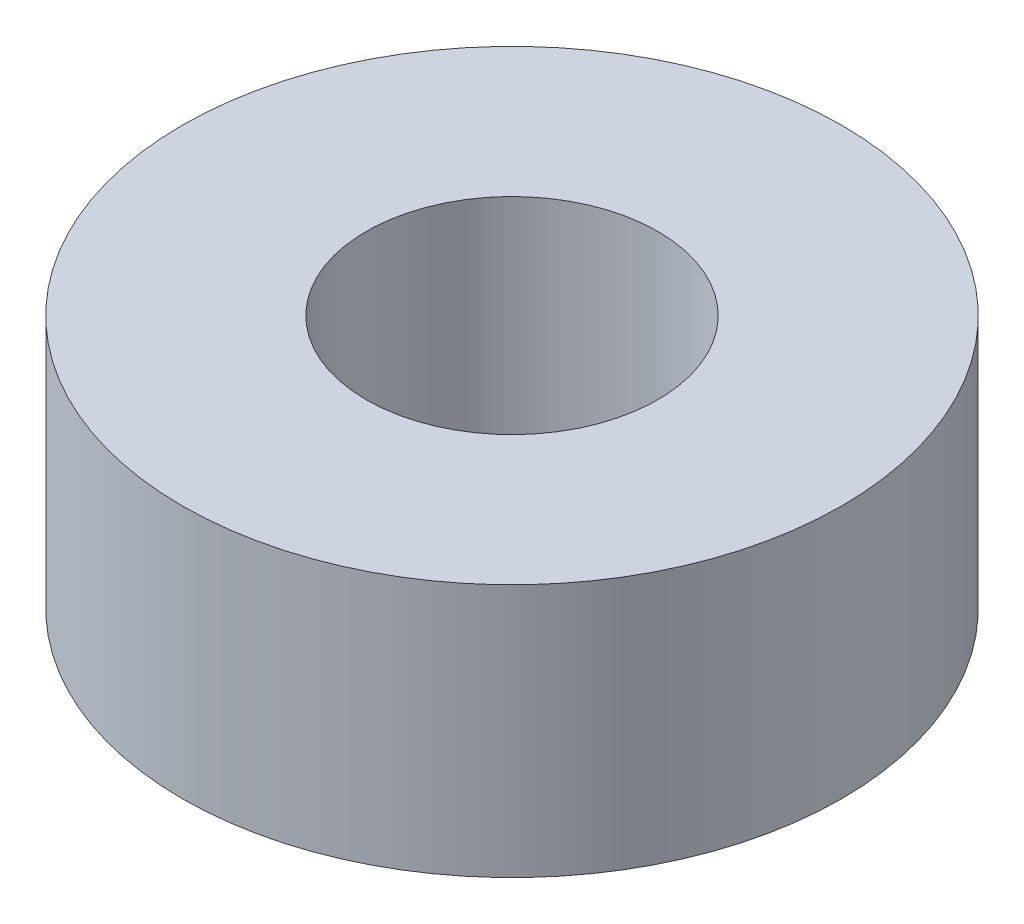
ISO-10303-21;
HEADER;
FILE_DESCRIPTION(('STEP AP214'),'2;1');
FILE_NAME('part.step','',(''),(''),'','','');
FILE_SCHEMA(('AUTOMOTIVE_DESIGN { 1 0 10303 214 1 1 1 1 }'));
ENDSEC;
DATA;
#1=APPLICATION_CONTEXT('core data for automotive mechanical design processes');
#2=APPLICATION_PROTOCOL_DEFINITION('international standard','automotive_design',2000,#1);
#3=PRODUCT_CONTEXT('',#1,'mechanical');
#4=PRODUCT('Part','Part','',(#3));
#5=PRODUCT_RELATED_PRODUCT_CATEGORY('part','',(#4));
#6=PRODUCT_DEFINITION_FORMATION('','',#4);
#7=PRODUCT_DEFINITION_CONTEXT('part definition',#1,'design');
#8=PRODUCT_DEFINITION('design','',#6,#7);
#9=PRODUCT_DEFINITION_SHAPE('','',#8);
#10=(LENGTH_UNIT() NAMED_UNIT(*) SI_UNIT(.MILLI.,.METRE.));
#11=(NAMED_UNIT(*) PLANE_ANGLE_UNIT() SI_UNIT($,.RADIAN.));
#12=(NAMED_UNIT(*) SI_UNIT($,.STERADIAN.) SOLID_ANGLE_UNIT());
#13=UNCERTAINTY_MEASURE_WITH_UNIT(LENGTH_MEASURE(1.E-05),#10,'distance_accuracy_value','');
#14=(GEOMETRIC_REPRESENTATION_CONTEXT(3) GLOBAL_UNCERTAINTY_ASSIGNED_CONTEXT((#13)) GLOBAL_UNIT_ASSIGNED_CONTEXT((#10,
#11,#12)) REPRESENTATION_CONTEXT('',''));
#15=CARTESIAN_POINT('',(0.,0.,0.));
#16=DIRECTION('',(0.,0.,1.));
#17=DIRECTION('',(1.,0.,0.));
#18=AXIS2_PLACEMENT_3D('',#15,#16,#17);
#19=CARTESIAN_POINT('',(0.,10.,0.));
#20=DIRECTION('',(0.,1.,0.));
#21=DIRECTION('',(0.,0.,1.));
#22=AXIS2_PLACEMENT_3D('',#19,#20,#21);
#23=PLANE('',#22);
#24=CARTESIAN_POINT('',(0.,10.,0.));
#25=DIRECTION('',(0.,1.,0.));
#26=DIRECTION('',(0.,0.,1.));
#27=AXIS2_PLACEMENT_3D('',#24,#25,#26);
#28=CIRCLE('',#27,26.);
#29=CARTESIAN_POINT('',(0.,10.,26.));
#30=VERTEX_POINT('',#29);
#31=EDGE_CURVE('E10',#30,#30,#28,.T.);
#32=ORIENTED_EDGE('',*,*,#31,.T.);
#33=EDGE_LOOP('',(#32));
#34=FACE_BOUND('',#33,.T.);
#35=CARTESIAN_POINT('',(0.,10.,0.));
#36=DIRECTION('',(0.,1.,0.));
#37=DIRECTION('',(0.,0.,1.));
#38=AXIS2_PLACEMENT_3D('',#35,#36,#37);
#39=CIRCLE('',#38,11.5);
#40=CARTESIAN_POINT('',(0.,10.,11.5));
#41=VERTEX_POINT('',#40);
#42=EDGE_CURVE('E42',#41,#41,#39,.T.);
#43=ORIENTED_EDGE('',*,*,#42,.F.);
#44=EDGE_LOOP('',(#43));
#45=FACE_BOUND('',#44,.T.);
#46=ADVANCED_FACE('F31',(#34,#45),#23,.T.);
#47=CARTESIAN_POINT('',(0.,-10.,0.));
#48=DIRECTION('',(0.,1.,0.));
#49=DIRECTION('',(0.,0.,1.));
#50=AXIS2_PLACEMENT_3D('',#47,#48,#49);
#51=PLANE('',#50);
#52=CARTESIAN_POINT('',(0.,-10.,0.));
#53=DIRECTION('',(0.,1.,0.));
#54=DIRECTION('',(0.,0.,1.));
#55=AXIS2_PLACEMENT_3D('',#52,#53,#54);
#56=CIRCLE('',#55,26.);
#57=CARTESIAN_POINT('',(0.,-10.,26.));
#58=VERTEX_POINT('',#57);
#59=EDGE_CURVE('E35',#58,#58,#56,.T.);
#60=ORIENTED_EDGE('',*,*,#59,.F.);
#61=EDGE_LOOP('',(#60));
#62=FACE_BOUND('',#61,.T.);
#63=CARTESIAN_POINT('',(0.,-10.,0.));
#64=DIRECTION('',(0.,1.,0.));
#65=DIRECTION('',(0.,0.,1.));
#66=AXIS2_PLACEMENT_3D('',#63,#64,#65);
#67=CIRCLE('',#66,11.5);
#68=CARTESIAN_POINT('',(0.,-10.,11.5));
#69=VERTEX_POINT('',#68);
#70=EDGE_CURVE('E44',#69,#69,#67,.T.);
#71=ORIENTED_EDGE('',*,*,#70,.T.);
#72=EDGE_LOOP('',(#71));
#73=FACE_BOUND('',#72,.T.);
#74=ADVANCED_FACE('F54',(#62,#73),#51,.F.);
#75=CARTESIAN_POINT('',(0.,10.,0.));
#76=DIRECTION('',(0.,-1.,0.));
#77=DIRECTION('',(0.,0.,-1.));
#78=AXIS2_PLACEMENT_3D('',#75,#76,#77);
#79=CYLINDRICAL_SURFACE('',#78,26.);
#80=ORIENTED_EDGE('',*,*,#31,.F.);
#81=EDGE_LOOP('',(#80));
#82=FACE_BOUND('',#81,.T.);
#83=ORIENTED_EDGE('',*,*,#59,.T.);
#84=EDGE_LOOP('',(#83));
#85=FACE_BOUND('',#84,.T.);
#86=ADVANCED_FACE('F33',(#82,#85),#79,.T.);
#87=CARTESIAN_POINT('',(0.,10.,0.));
#88=DIRECTION('',(0.,-1.,0.));
#89=DIRECTION('',(0.,0.,-1.));
#90=AXIS2_PLACEMENT_3D('',#87,#88,#89);
#91=CYLINDRICAL_SURFACE('',#90,11.5);
#92=ORIENTED_EDGE('',*,*,#42,.T.);
#93=EDGE_LOOP('',(#92));
#94=FACE_BOUND('',#93,.T.);
#95=ORIENTED_EDGE('',*,*,#70,.F.);
#96=EDGE_LOOP('',(#95));
#97=FACE_BOUND('',#96,.T.);
#98=ADVANCED_FACE('F50',(#94,#97),#91,.F.);
#99=CLOSED_SHELL('',(#46,#74,#86,#98));
#100=MANIFOLD_SOLID_BREP('B2',#99);
#101=ADVANCED_BREP_SHAPE_REPRESENTATION('',(#18,#100),#14);
#102=SHAPE_DEFINITION_REPRESENTATION(#9,#101);
ENDSEC;
END-ISO-10303-21;
